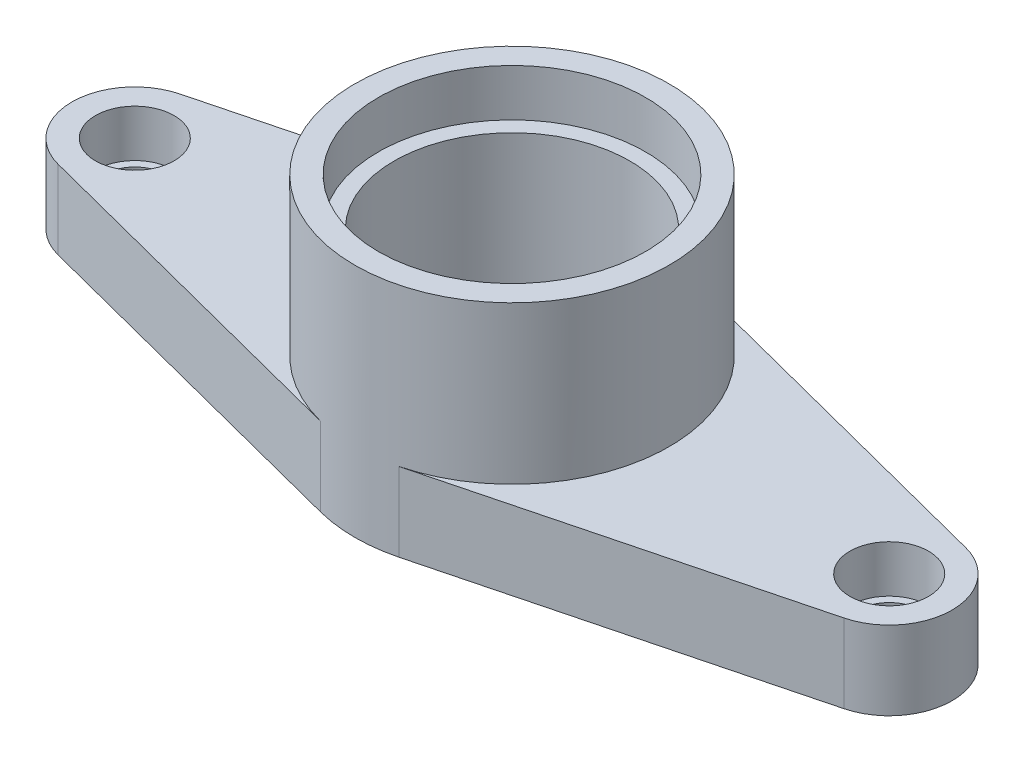
ISO-10303-21;
HEADER;
FILE_DESCRIPTION(('STEP AP214'),'2;1');
FILE_NAME('part.step','',(''),(''),'','','');
FILE_SCHEMA(('AUTOMOTIVE_DESIGN { 1 0 10303 214 1 1 1 1 }'));
ENDSEC;
DATA;
#1=APPLICATION_CONTEXT('core data for automotive mechanical design processes');
#2=APPLICATION_PROTOCOL_DEFINITION('international standard','automotive_design',2000,#1);
#3=PRODUCT_CONTEXT('',#1,'mechanical');
#4=PRODUCT('Part','Part','',(#3));
#5=PRODUCT_RELATED_PRODUCT_CATEGORY('part','',(#4));
#6=PRODUCT_DEFINITION_FORMATION('','',#4);
#7=PRODUCT_DEFINITION_CONTEXT('part definition',#1,'design');
#8=PRODUCT_DEFINITION('design','',#6,#7);
#9=PRODUCT_DEFINITION_SHAPE('','',#8);
#10=(LENGTH_UNIT() NAMED_UNIT(*) SI_UNIT(.MILLI.,.METRE.));
#11=(NAMED_UNIT(*) PLANE_ANGLE_UNIT() SI_UNIT($,.RADIAN.));
#12=(NAMED_UNIT(*) SI_UNIT($,.STERADIAN.) SOLID_ANGLE_UNIT());
#13=UNCERTAINTY_MEASURE_WITH_UNIT(LENGTH_MEASURE(1.E-05),#10,'distance_accuracy_value','');
#14=(GEOMETRIC_REPRESENTATION_CONTEXT(3) GLOBAL_UNCERTAINTY_ASSIGNED_CONTEXT((#13)) GLOBAL_UNIT_ASSIGNED_CONTEXT((#10,
#11,#12)) REPRESENTATION_CONTEXT('',''));
#15=CARTESIAN_POINT('',(0.,0.,0.));
#16=DIRECTION('',(0.,0.,1.));
#17=DIRECTION('',(1.,0.,0.));
#18=AXIS2_PLACEMENT_3D('',#15,#16,#17);
#19=CARTESIAN_POINT('',(120.,25.,0.));
#20=DIRECTION('',(0.,1.,0.));
#21=DIRECTION('',(0.,0.,1.));
#22=AXIS2_PLACEMENT_3D('',#19,#20,#21);
#23=PLANE('',#22);
#24=CARTESIAN_POINT('',(120.,25.,0.));
#25=DIRECTION('',(0.,1.,0.));
#26=DIRECTION('',(0.,0.,1.));
#27=AXIS2_PLACEMENT_3D('',#24,#25,#26);
#28=CIRCLE('',#27,12.5);
#29=CARTESIAN_POINT('',(120.,25.,12.5));
#30=VERTEX_POINT('',#29);
#31=EDGE_CURVE('E382',#30,#30,#28,.T.);
#32=ORIENTED_EDGE('',*,*,#31,.F.);
#33=EDGE_LOOP('',(#32));
#34=FACE_BOUND('',#33,.T.);
#35=CARTESIAN_POINT('',(0.,25.,0.));
#36=DIRECTION('',(0.,1.,0.));
#37=DIRECTION('',(0.,0.,1.));
#38=AXIS2_PLACEMENT_3D('',#35,#36,#37);
#39=CIRCLE('',#38,50.);
#40=CARTESIAN_POINT('',(12.5,25.,48.4122918275927));
#41=VERTEX_POINT('',#40);
#42=CARTESIAN_POINT('',(12.5,25.,-48.4122918275927));
#43=VERTEX_POINT('',#42);
#44=EDGE_CURVE('E46',#41,#43,#39,.T.);
#45=ORIENTED_EDGE('',*,*,#44,.F.);
#46=DIRECTION('',(-0.968245836551854,0.,0.25));
#47=VECTOR('',#46,1.);
#48=CARTESIAN_POINT('',(125.,25.,19.3649167310371));
#49=LINE('',#48,#47);
#50=CARTESIAN_POINT('',(125.,25.,19.3649167310371));
#51=VERTEX_POINT('',#50);
#52=EDGE_CURVE('E131',#51,#41,#49,.T.);
#53=ORIENTED_EDGE('',*,*,#52,.F.);
#54=CARTESIAN_POINT('',(120.,25.,0.));
#55=DIRECTION('',(0.,1.,0.));
#56=DIRECTION('',(0.,0.,1.));
#57=AXIS2_PLACEMENT_3D('',#54,#55,#56);
#58=CIRCLE('',#57,20.);
#59=CARTESIAN_POINT('',(125.,25.,-19.3649167310371));
#60=VERTEX_POINT('',#59);
#61=EDGE_CURVE('E155',#51,#60,#58,.T.);
#62=ORIENTED_EDGE('',*,*,#61,.T.);
#63=DIRECTION('',(-0.968245836551854,0.,-0.25));
#64=VECTOR('',#63,1.);
#65=CARTESIAN_POINT('',(125.,25.,-19.3649167310371));
#66=LINE('',#65,#64);
#67=EDGE_CURVE('E95',#60,#43,#66,.T.);
#68=ORIENTED_EDGE('',*,*,#67,.T.);
#69=EDGE_LOOP('',(#45,#53,#62,#68));
#70=FACE_BOUND('',#69,.T.);
#71=ADVANCED_FACE('F35',(#34,#70),#23,.T.);
#72=CARTESIAN_POINT('',(120.,25.,0.));
#73=DIRECTION('',(0.,-1.,0.));
#74=DIRECTION('',(0.,0.,-1.));
#75=AXIS2_PLACEMENT_3D('',#72,#73,#74);
#76=CYLINDRICAL_SURFACE('',#75,20.);
#77=CARTESIAN_POINT('',(120.,0.,0.));
#78=DIRECTION('',(0.,1.,0.));
#79=DIRECTION('',(0.,0.,1.));
#80=AXIS2_PLACEMENT_3D('',#77,#78,#79);
#81=CIRCLE('',#80,20.);
#82=CARTESIAN_POINT('',(125.,0.,19.3649167310371));
#83=VERTEX_POINT('',#82);
#84=CARTESIAN_POINT('',(125.,0.,-19.3649167310371));
#85=VERTEX_POINT('',#84);
#86=EDGE_CURVE('E136',#83,#85,#81,.T.);
#87=ORIENTED_EDGE('',*,*,#86,.T.);
#88=DIRECTION('',(0.,-1.,0.));
#89=VECTOR('',#88,1.);
#90=CARTESIAN_POINT('',(125.,25.,-19.3649167310371));
#91=LINE('',#90,#89);
#92=EDGE_CURVE('E39',#60,#85,#91,.T.);
#93=ORIENTED_EDGE('',*,*,#92,.F.);
#94=ORIENTED_EDGE('',*,*,#61,.F.);
#95=DIRECTION('',(0.,-1.,0.));
#96=VECTOR('',#95,1.);
#97=CARTESIAN_POINT('',(125.,25.,19.3649167310371));
#98=LINE('',#97,#96);
#99=EDGE_CURVE('E54',#51,#83,#98,.T.);
#100=ORIENTED_EDGE('',*,*,#99,.T.);
#101=EDGE_LOOP('',(#87,#93,#94,#100));
#102=FACE_BOUND('',#101,.T.);
#103=ADVANCED_FACE('F37',(#102),#76,.T.);
#104=CARTESIAN_POINT('',(125.,25.,-19.3649167310371));
#105=DIRECTION('',(-0.25,0.,0.968245836551854));
#106=DIRECTION('',(0.968245836551854,0.,0.25));
#107=AXIS2_PLACEMENT_3D('',#104,#105,#106);
#108=PLANE('',#107);
#109=DIRECTION('',(-0.968245836551854,0.,-0.25));
#110=VECTOR('',#109,1.);
#111=CARTESIAN_POINT('',(125.,0.,-19.3649167310371));
#112=LINE('',#111,#110);
#113=CARTESIAN_POINT('',(12.5,0.,-48.4122918275927));
#114=VERTEX_POINT('',#113);
#115=EDGE_CURVE('E138',#85,#114,#112,.T.);
#116=ORIENTED_EDGE('',*,*,#115,.T.);
#117=DIRECTION('',(0.,-1.,0.));
#118=VECTOR('',#117,1.);
#119=CARTESIAN_POINT('',(12.5,25.,-48.4122918275927));
#120=LINE('',#119,#118);
#121=EDGE_CURVE('E161',#43,#114,#120,.T.);
#122=ORIENTED_EDGE('',*,*,#121,.F.);
#123=ORIENTED_EDGE('',*,*,#67,.F.);
#124=ORIENTED_EDGE('',*,*,#92,.T.);
#125=EDGE_LOOP('',(#116,#122,#123,#124));
#126=FACE_BOUND('',#125,.T.);
#127=ADVANCED_FACE('F167',(#126),#108,.F.);
#128=CARTESIAN_POINT('',(-125.,25.,-19.3649167310371));
#129=DIRECTION('',(-0.25,0.,-0.968245836551854));
#130=DIRECTION('',(-0.968245836551854,0.,0.25));
#131=AXIS2_PLACEMENT_3D('',#128,#129,#130);
#132=PLANE('',#131);
#133=DIRECTION('',(0.968245836551854,0.,-0.25));
#134=VECTOR('',#133,1.);
#135=CARTESIAN_POINT('',(-125.,0.,-19.3649167310371));
#136=LINE('',#135,#134);
#137=CARTESIAN_POINT('',(-125.,0.,-19.3649167310371));
#138=VERTEX_POINT('',#137);
#139=CARTESIAN_POINT('',(-12.5,0.,-48.4122918275927));
#140=VERTEX_POINT('',#139);
#141=EDGE_CURVE('E144',#138,#140,#136,.T.);
#142=ORIENTED_EDGE('',*,*,#141,.F.);
#143=DIRECTION('',(0.,-1.,0.));
#144=VECTOR('',#143,1.);
#145=CARTESIAN_POINT('',(-125.,25.,-19.3649167310371));
#146=LINE('',#145,#144);
#147=CARTESIAN_POINT('',(-125.,25.,-19.3649167310371));
#148=VERTEX_POINT('',#147);
#149=EDGE_CURVE('E126',#148,#138,#146,.T.);
#150=ORIENTED_EDGE('',*,*,#149,.F.);
#151=DIRECTION('',(0.968245836551854,0.,-0.25));
#152=VECTOR('',#151,1.);
#153=CARTESIAN_POINT('',(-125.,25.,-19.3649167310371));
#154=LINE('',#153,#152);
#155=CARTESIAN_POINT('',(-12.5,25.,-48.4122918275927));
#156=VERTEX_POINT('',#155);
#157=EDGE_CURVE('E116',#148,#156,#154,.T.);
#158=ORIENTED_EDGE('',*,*,#157,.T.);
#159=DIRECTION('',(0.,-1.,0.));
#160=VECTOR('',#159,1.);
#161=CARTESIAN_POINT('',(-12.5,25.,-48.4122918275927));
#162=LINE('',#161,#160);
#163=EDGE_CURVE('E160',#156,#140,#162,.T.);
#164=ORIENTED_EDGE('',*,*,#163,.T.);
#165=EDGE_LOOP('',(#142,#150,#158,#164));
#166=FACE_BOUND('',#165,.T.);
#167=ADVANCED_FACE('F232',(#166),#132,.T.);
#168=CARTESIAN_POINT('',(-120.,25.,0.));
#169=DIRECTION('',(0.,-1.,0.));
#170=DIRECTION('',(0.,0.,-1.));
#171=AXIS2_PLACEMENT_3D('',#168,#169,#170);
#172=CYLINDRICAL_SURFACE('',#171,20.);
#173=CARTESIAN_POINT('',(-120.,0.,0.));
#174=DIRECTION('',(0.,1.,0.));
#175=DIRECTION('',(0.,0.,1.));
#176=AXIS2_PLACEMENT_3D('',#173,#174,#175);
#177=CIRCLE('',#176,20.);
#178=CARTESIAN_POINT('',(-125.,0.,19.3649167310371));
#179=VERTEX_POINT('',#178);
#180=EDGE_CURVE('E123',#138,#179,#177,.T.);
#181=ORIENTED_EDGE('',*,*,#180,.T.);
#182=DIRECTION('',(0.,-1.,0.));
#183=VECTOR('',#182,1.);
#184=CARTESIAN_POINT('',(-125.,25.,19.3649167310371));
#185=LINE('',#184,#183);
#186=CARTESIAN_POINT('',(-125.,25.,19.3649167310371));
#187=VERTEX_POINT('',#186);
#188=EDGE_CURVE('E120',#187,#179,#185,.T.);
#189=ORIENTED_EDGE('',*,*,#188,.F.);
#190=CARTESIAN_POINT('',(-120.,25.,0.));
#191=DIRECTION('',(0.,1.,0.));
#192=DIRECTION('',(0.,0.,1.));
#193=AXIS2_PLACEMENT_3D('',#190,#191,#192);
#194=CIRCLE('',#193,20.);
#195=EDGE_CURVE('E109',#148,#187,#194,.T.);
#196=ORIENTED_EDGE('',*,*,#195,.F.);
#197=ORIENTED_EDGE('',*,*,#149,.T.);
#198=EDGE_LOOP('',(#181,#189,#196,#197));
#199=FACE_BOUND('',#198,.T.);
#200=ADVANCED_FACE('F121',(#199),#172,.T.);
#201=CARTESIAN_POINT('',(-125.,25.,19.3649167310371));
#202=DIRECTION('',(0.25,0.,-0.968245836551854));
#203=DIRECTION('',(-0.968245836551854,0.,-0.25));
#204=AXIS2_PLACEMENT_3D('',#201,#202,#203);
#205=PLANE('',#204);
#206=DIRECTION('',(0.968245836551854,0.,0.25));
#207=VECTOR('',#206,1.);
#208=CARTESIAN_POINT('',(-125.,0.,19.3649167310371));
#209=LINE('',#208,#207);
#210=CARTESIAN_POINT('',(-12.5,0.,48.4122918275927));
#211=VERTEX_POINT('',#210);
#212=EDGE_CURVE('E148',#179,#211,#209,.T.);
#213=ORIENTED_EDGE('',*,*,#212,.T.);
#214=DIRECTION('',(0.,-1.,0.));
#215=VECTOR('',#214,1.);
#216=CARTESIAN_POINT('',(-12.5,25.,48.4122918275927));
#217=LINE('',#216,#215);
#218=CARTESIAN_POINT('',(-12.5,25.,48.4122918275927));
#219=VERTEX_POINT('',#218);
#220=EDGE_CURVE('E127',#219,#211,#217,.T.);
#221=ORIENTED_EDGE('',*,*,#220,.F.);
#222=DIRECTION('',(0.968245836551854,0.,0.25));
#223=VECTOR('',#222,1.);
#224=CARTESIAN_POINT('',(-125.,25.,19.3649167310371));
#225=LINE('',#224,#223);
#226=EDGE_CURVE('E113',#187,#219,#225,.T.);
#227=ORIENTED_EDGE('',*,*,#226,.F.);
#228=ORIENTED_EDGE('',*,*,#188,.T.);
#229=EDGE_LOOP('',(#213,#221,#227,#228));
#230=FACE_BOUND('',#229,.T.);
#231=ADVANCED_FACE('F129',(#230),#205,.F.);
#232=CARTESIAN_POINT('',(0.,25.,0.));
#233=DIRECTION('',(0.,-1.,0.));
#234=DIRECTION('',(0.,0.,-1.));
#235=AXIS2_PLACEMENT_3D('',#232,#233,#234);
#236=CYLINDRICAL_SURFACE('',#235,50.);
#237=CARTESIAN_POINT('',(0.,0.,0.));
#238=DIRECTION('',(0.,1.,0.));
#239=DIRECTION('',(0.,0.,1.));
#240=AXIS2_PLACEMENT_3D('',#237,#238,#239);
#241=CIRCLE('',#240,50.);
#242=CARTESIAN_POINT('',(12.5,0.,48.4122918275927));
#243=VERTEX_POINT('',#242);
#244=EDGE_CURVE('E150',#211,#243,#241,.T.);
#245=ORIENTED_EDGE('',*,*,#244,.T.);
#246=DIRECTION('',(0.,-1.,0.));
#247=VECTOR('',#246,1.);
#248=CARTESIAN_POINT('',(12.5,25.,48.4122918275927));
#249=LINE('',#248,#247);
#250=EDGE_CURVE('E82',#41,#243,#249,.T.);
#251=ORIENTED_EDGE('',*,*,#250,.F.);
#252=ORIENTED_EDGE('',*,*,#44,.T.);
#253=ORIENTED_EDGE('',*,*,#121,.T.);
#254=CARTESIAN_POINT('',(0.,0.,0.));
#255=DIRECTION('',(0.,1.,0.));
#256=DIRECTION('',(0.,0.,1.));
#257=AXIS2_PLACEMENT_3D('',#254,#255,#256);
#258=CIRCLE('',#257,50.);
#259=EDGE_CURVE('E141',#114,#140,#258,.T.);
#260=ORIENTED_EDGE('',*,*,#259,.T.);
#261=ORIENTED_EDGE('',*,*,#163,.F.);
#262=EDGE_CURVE('E11',#156,#219,#39,.T.);
#263=ORIENTED_EDGE('',*,*,#262,.T.);
#264=ORIENTED_EDGE('',*,*,#220,.T.);
#265=EDGE_LOOP('',(#245,#251,#252,#253,#260,#261,#263,#264));
#266=FACE_BOUND('',#265,.T.);
#267=CARTESIAN_POINT('',(0.,75.,0.));
#268=DIRECTION('',(0.,1.,0.));
#269=DIRECTION('',(0.,0.,1.));
#270=AXIS2_PLACEMENT_3D('',#267,#268,#269);
#271=CIRCLE('',#270,50.);
#272=CARTESIAN_POINT('',(0.,75.,50.));
#273=VERTEX_POINT('',#272);
#274=EDGE_CURVE('E139',#273,#273,#271,.T.);
#275=ORIENTED_EDGE('',*,*,#274,.F.);
#276=EDGE_LOOP('',(#275));
#277=FACE_BOUND('',#276,.T.);
#278=ADVANCED_FACE('F173',(#266,#277),#236,.T.);
#279=CARTESIAN_POINT('',(125.,25.,19.3649167310371));
#280=DIRECTION('',(0.25,0.,0.968245836551854));
#281=DIRECTION('',(0.968245836551854,0.,-0.25));
#282=AXIS2_PLACEMENT_3D('',#279,#280,#281);
#283=PLANE('',#282);
#284=DIRECTION('',(-0.968245836551854,0.,0.25));
#285=VECTOR('',#284,1.);
#286=CARTESIAN_POINT('',(125.,0.,19.3649167310371));
#287=LINE('',#286,#285);
#288=EDGE_CURVE('E152',#83,#243,#287,.T.);
#289=ORIENTED_EDGE('',*,*,#288,.F.);
#290=ORIENTED_EDGE('',*,*,#99,.F.);
#291=ORIENTED_EDGE('',*,*,#52,.T.);
#292=ORIENTED_EDGE('',*,*,#250,.T.);
#293=EDGE_LOOP('',(#289,#290,#291,#292));
#294=FACE_BOUND('',#293,.T.);
#295=ADVANCED_FACE('F171',(#294),#283,.T.);
#296=CARTESIAN_POINT('',(-120.,25.,0.));
#297=DIRECTION('',(0.,1.,0.));
#298=DIRECTION('',(0.,0.,1.));
#299=AXIS2_PLACEMENT_3D('',#296,#297,#298);
#300=CIRCLE('',#299,12.5);
#301=CARTESIAN_POINT('',(-120.,25.,12.5));
#302=VERTEX_POINT('',#301);
#303=EDGE_CURVE('E384',#302,#302,#300,.T.);
#304=ORIENTED_EDGE('',*,*,#303,.F.);
#305=EDGE_LOOP('',(#304));
#306=FACE_BOUND('',#305,.T.);
#307=ORIENTED_EDGE('',*,*,#262,.F.);
#308=ORIENTED_EDGE('',*,*,#157,.F.);
#309=ORIENTED_EDGE('',*,*,#195,.T.);
#310=ORIENTED_EDGE('',*,*,#226,.T.);
#311=EDGE_LOOP('',(#307,#308,#309,#310));
#312=FACE_BOUND('',#311,.T.);
#313=ADVANCED_FACE('F111',(#306,#312),#23,.T.);
#314=CARTESIAN_POINT('',(120.,0.,0.));
#315=DIRECTION('',(0.,1.,0.));
#316=DIRECTION('',(0.,0.,1.));
#317=AXIS2_PLACEMENT_3D('',#314,#315,#316);
#318=PLANE('',#317);
#319=CARTESIAN_POINT('',(-120.,0.,0.));
#320=DIRECTION('',(0.,1.,0.));
#321=DIRECTION('',(0.,0.,1.));
#322=AXIS2_PLACEMENT_3D('',#319,#320,#321);
#323=CIRCLE('',#322,9.99999999999999);
#324=CARTESIAN_POINT('',(-120.,0.,9.99999999999999));
#325=VERTEX_POINT('',#324);
#326=EDGE_CURVE('E203',#325,#325,#323,.T.);
#327=ORIENTED_EDGE('',*,*,#326,.T.);
#328=EDGE_LOOP('',(#327));
#329=FACE_BOUND('',#328,.T.);
#330=CARTESIAN_POINT('',(120.,0.,0.));
#331=DIRECTION('',(0.,1.,0.));
#332=DIRECTION('',(0.,0.,1.));
#333=AXIS2_PLACEMENT_3D('',#330,#331,#332);
#334=CIRCLE('',#333,10.);
#335=CARTESIAN_POINT('',(120.,0.,9.99999999999998));
#336=VERTEX_POINT('',#335);
#337=EDGE_CURVE('E207',#336,#336,#334,.T.);
#338=ORIENTED_EDGE('',*,*,#337,.T.);
#339=EDGE_LOOP('',(#338));
#340=FACE_BOUND('',#339,.T.);
#341=CARTESIAN_POINT('',(0.,0.,0.));
#342=DIRECTION('',(0.,1.,0.));
#343=DIRECTION('',(0.,0.,1.));
#344=AXIS2_PLACEMENT_3D('',#341,#342,#343);
#345=CIRCLE('',#344,37.5);
#346=CARTESIAN_POINT('',(0.,0.,37.5));
#347=VERTEX_POINT('',#346);
#348=EDGE_CURVE('E210',#347,#347,#345,.T.);
#349=ORIENTED_EDGE('',*,*,#348,.T.);
#350=EDGE_LOOP('',(#349));
#351=FACE_BOUND('',#350,.T.);
#352=ORIENTED_EDGE('',*,*,#86,.F.);
#353=ORIENTED_EDGE('',*,*,#288,.T.);
#354=ORIENTED_EDGE('',*,*,#244,.F.);
#355=ORIENTED_EDGE('',*,*,#212,.F.);
#356=ORIENTED_EDGE('',*,*,#180,.F.);
#357=ORIENTED_EDGE('',*,*,#141,.T.);
#358=ORIENTED_EDGE('',*,*,#259,.F.);
#359=ORIENTED_EDGE('',*,*,#115,.F.);
#360=EDGE_LOOP('',(#352,#353,#354,#355,#356,#357,#358,#359));
#361=FACE_BOUND('',#360,.T.);
#362=ADVANCED_FACE('F169',(#329,#340,#351,#361),#318,.F.);
#363=CARTESIAN_POINT('',(0.,75.,0.));
#364=DIRECTION('',(0.,1.,0.));
#365=DIRECTION('',(0.,0.,1.));
#366=AXIS2_PLACEMENT_3D('',#363,#364,#365);
#367=PLANE('',#366);
#368=CARTESIAN_POINT('',(0.,75.,0.));
#369=DIRECTION('',(0.,1.,0.));
#370=DIRECTION('',(0.,0.,1.));
#371=AXIS2_PLACEMENT_3D('',#368,#369,#370);
#372=CIRCLE('',#371,42.5);
#373=CARTESIAN_POINT('',(0.,75.,42.5));
#374=VERTEX_POINT('',#373);
#375=EDGE_CURVE('E212',#374,#374,#372,.T.);
#376=ORIENTED_EDGE('',*,*,#375,.F.);
#377=EDGE_LOOP('',(#376));
#378=FACE_BOUND('',#377,.T.);
#379=ORIENTED_EDGE('',*,*,#274,.T.);
#380=EDGE_LOOP('',(#379));
#381=FACE_BOUND('',#380,.T.);
#382=ADVANCED_FACE('F191',(#378,#381),#367,.T.);
#383=CARTESIAN_POINT('',(0.,60.,0.));
#384=DIRECTION('',(0.,1.,0.));
#385=DIRECTION('',(0.,0.,1.));
#386=AXIS2_PLACEMENT_3D('',#383,#384,#385);
#387=CYLINDRICAL_SURFACE('',#386,42.5);
#388=CARTESIAN_POINT('',(0.,60.,0.));
#389=DIRECTION('',(0.,1.,0.));
#390=DIRECTION('',(0.,0.,1.));
#391=AXIS2_PLACEMENT_3D('',#388,#389,#390);
#392=CIRCLE('',#391,42.5);
#393=CARTESIAN_POINT('',(0.,60.,42.5));
#394=VERTEX_POINT('',#393);
#395=EDGE_CURVE('E216',#394,#394,#392,.T.);
#396=ORIENTED_EDGE('',*,*,#395,.F.);
#397=EDGE_LOOP('',(#396));
#398=FACE_BOUND('',#397,.T.);
#399=ORIENTED_EDGE('',*,*,#375,.T.);
#400=EDGE_LOOP('',(#399));
#401=FACE_BOUND('',#400,.T.);
#402=ADVANCED_FACE('F198',(#398,#401),#387,.F.);
#403=CARTESIAN_POINT('',(0.,60.,0.));
#404=DIRECTION('',(0.,1.,0.));
#405=DIRECTION('',(0.,0.,1.));
#406=AXIS2_PLACEMENT_3D('',#403,#404,#405);
#407=PLANE('',#406);
#408=CARTESIAN_POINT('',(0.,60.,0.));
#409=DIRECTION('',(0.,1.,0.));
#410=DIRECTION('',(0.,0.,1.));
#411=AXIS2_PLACEMENT_3D('',#408,#409,#410);
#412=CIRCLE('',#411,37.5);
#413=CARTESIAN_POINT('',(0.,60.,37.5));
#414=VERTEX_POINT('',#413);
#415=EDGE_CURVE('E213',#414,#414,#412,.T.);
#416=ORIENTED_EDGE('',*,*,#415,.F.);
#417=EDGE_LOOP('',(#416));
#418=FACE_BOUND('',#417,.T.);
#419=ORIENTED_EDGE('',*,*,#395,.T.);
#420=EDGE_LOOP('',(#419));
#421=FACE_BOUND('',#420,.T.);
#422=ADVANCED_FACE('F272',(#418,#421),#407,.T.);
#423=CARTESIAN_POINT('',(0.,0.,0.));
#424=DIRECTION('',(0.,1.,0.));
#425=DIRECTION('',(0.,0.,1.));
#426=AXIS2_PLACEMENT_3D('',#423,#424,#425);
#427=CYLINDRICAL_SURFACE('',#426,37.5);
#428=ORIENTED_EDGE('',*,*,#348,.F.);
#429=EDGE_LOOP('',(#428));
#430=FACE_BOUND('',#429,.T.);
#431=ORIENTED_EDGE('',*,*,#415,.T.);
#432=EDGE_LOOP('',(#431));
#433=FACE_BOUND('',#432,.T.);
#434=ADVANCED_FACE('F281',(#430,#433),#427,.F.);
#435=CARTESIAN_POINT('',(-120.,10.,0.));
#436=DIRECTION('',(0.,1.,0.));
#437=DIRECTION('',(0.,0.,1.));
#438=AXIS2_PLACEMENT_3D('',#435,#436,#437);
#439=CYLINDRICAL_SURFACE('',#438,12.5);
#440=CARTESIAN_POINT('',(-120.,10.,0.));
#441=DIRECTION('',(0.,1.,0.));
#442=DIRECTION('',(0.,0.,1.));
#443=AXIS2_PLACEMENT_3D('',#440,#441,#442);
#444=CIRCLE('',#443,12.5);
#445=CARTESIAN_POINT('',(-120.,10.,12.5));
#446=VERTEX_POINT('',#445);
#447=EDGE_CURVE('E222',#446,#446,#444,.T.);
#448=ORIENTED_EDGE('',*,*,#447,.F.);
#449=EDGE_LOOP('',(#448));
#450=FACE_BOUND('',#449,.T.);
#451=ORIENTED_EDGE('',*,*,#303,.T.);
#452=EDGE_LOOP('',(#451));
#453=FACE_BOUND('',#452,.T.);
#454=ADVANCED_FACE('F290',(#450,#453),#439,.F.);
#455=CARTESIAN_POINT('',(-120.,10.,0.));
#456=DIRECTION('',(0.,1.,0.));
#457=DIRECTION('',(0.,0.,1.));
#458=AXIS2_PLACEMENT_3D('',#455,#456,#457);
#459=PLANE('',#458);
#460=CARTESIAN_POINT('',(-120.,10.,0.));
#461=DIRECTION('',(0.,1.,0.));
#462=DIRECTION('',(0.,0.,1.));
#463=AXIS2_PLACEMENT_3D('',#460,#461,#462);
#464=CIRCLE('',#463,9.99999999999999);
#465=CARTESIAN_POINT('',(-120.,10.,9.99999999999999));
#466=VERTEX_POINT('',#465);
#467=EDGE_CURVE('E372',#466,#466,#464,.T.);
#468=ORIENTED_EDGE('',*,*,#467,.F.);
#469=EDGE_LOOP('',(#468));
#470=FACE_BOUND('',#469,.T.);
#471=ORIENTED_EDGE('',*,*,#447,.T.);
#472=EDGE_LOOP('',(#471));
#473=FACE_BOUND('',#472,.T.);
#474=ADVANCED_FACE('F312',(#470,#473),#459,.T.);
#475=CARTESIAN_POINT('',(120.,10.,0.));
#476=DIRECTION('',(0.,1.,0.));
#477=DIRECTION('',(0.,0.,1.));
#478=AXIS2_PLACEMENT_3D('',#475,#476,#477);
#479=CYLINDRICAL_SURFACE('',#478,12.5);
#480=CARTESIAN_POINT('',(120.,10.,0.));
#481=DIRECTION('',(0.,1.,0.));
#482=DIRECTION('',(0.,0.,1.));
#483=AXIS2_PLACEMENT_3D('',#480,#481,#482);
#484=CIRCLE('',#483,12.5);
#485=CARTESIAN_POINT('',(120.,10.,12.5));
#486=VERTEX_POINT('',#485);
#487=EDGE_CURVE('E219',#486,#486,#484,.T.);
#488=ORIENTED_EDGE('',*,*,#487,.F.);
#489=EDGE_LOOP('',(#488));
#490=FACE_BOUND('',#489,.T.);
#491=ORIENTED_EDGE('',*,*,#31,.T.);
#492=EDGE_LOOP('',(#491));
#493=FACE_BOUND('',#492,.T.);
#494=ADVANCED_FACE('F320',(#490,#493),#479,.F.);
#495=CARTESIAN_POINT('',(120.,10.,0.));
#496=DIRECTION('',(0.,1.,0.));
#497=DIRECTION('',(0.,0.,1.));
#498=AXIS2_PLACEMENT_3D('',#495,#496,#497);
#499=PLANE('',#498);
#500=CARTESIAN_POINT('',(120.,10.,0.));
#501=DIRECTION('',(0.,1.,0.));
#502=DIRECTION('',(0.,0.,1.));
#503=AXIS2_PLACEMENT_3D('',#500,#501,#502);
#504=CIRCLE('',#503,10.);
#505=CARTESIAN_POINT('',(120.,10.,9.99999999999998));
#506=VERTEX_POINT('',#505);
#507=EDGE_CURVE('E375',#506,#506,#504,.T.);
#508=ORIENTED_EDGE('',*,*,#507,.F.);
#509=EDGE_LOOP('',(#508));
#510=FACE_BOUND('',#509,.T.);
#511=ORIENTED_EDGE('',*,*,#487,.T.);
#512=EDGE_LOOP('',(#511));
#513=FACE_BOUND('',#512,.T.);
#514=ADVANCED_FACE('F324',(#510,#513),#499,.T.);
#515=CARTESIAN_POINT('',(120.,0.,0.));
#516=DIRECTION('',(0.,1.,0.));
#517=DIRECTION('',(0.,0.,1.));
#518=AXIS2_PLACEMENT_3D('',#515,#516,#517);
#519=CYLINDRICAL_SURFACE('',#518,10.);
#520=ORIENTED_EDGE('',*,*,#337,.F.);
#521=EDGE_LOOP('',(#520));
#522=FACE_BOUND('',#521,.T.);
#523=ORIENTED_EDGE('',*,*,#507,.T.);
#524=EDGE_LOOP('',(#523));
#525=FACE_BOUND('',#524,.T.);
#526=ADVANCED_FACE('F345',(#522,#525),#519,.F.);
#527=CARTESIAN_POINT('',(-120.,0.,0.));
#528=DIRECTION('',(0.,1.,0.));
#529=DIRECTION('',(0.,0.,1.));
#530=AXIS2_PLACEMENT_3D('',#527,#528,#529);
#531=CYLINDRICAL_SURFACE('',#530,9.99999999999999);
#532=ORIENTED_EDGE('',*,*,#326,.F.);
#533=EDGE_LOOP('',(#532));
#534=FACE_BOUND('',#533,.T.);
#535=ORIENTED_EDGE('',*,*,#467,.T.);
#536=EDGE_LOOP('',(#535));
#537=FACE_BOUND('',#536,.T.);
#538=ADVANCED_FACE('F355',(#534,#537),#531,.F.);
#539=CLOSED_SHELL('',(#71,#103,#127,#167,#200,#231,#278,#295,#313,#362,#382,#402,#422,#434,#454,
#474,#494,#514,#526,#538));
#540=MANIFOLD_SOLID_BREP('B2',#539);
#541=ADVANCED_BREP_SHAPE_REPRESENTATION('',(#18,#540),#14);
#542=SHAPE_DEFINITION_REPRESENTATION(#9,#541);
ENDSEC;
END-ISO-10303-21;
